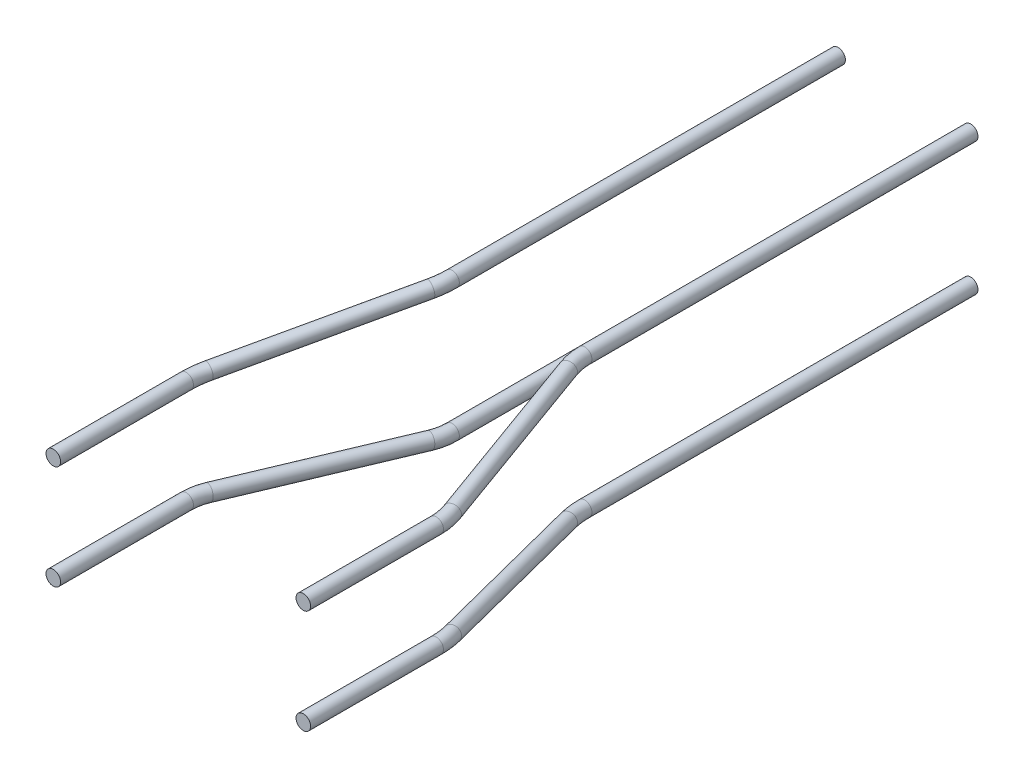
ISO-10303-21;
HEADER;
FILE_DESCRIPTION(('STEP AP214'),'2;1');
FILE_NAME('part.step','',(''),(''),'','','');
FILE_SCHEMA(('AUTOMOTIVE_DESIGN { 1 0 10303 214 1 1 1 1 }'));
ENDSEC;
DATA;
#1=APPLICATION_CONTEXT('core data for automotive mechanical design processes');
#2=APPLICATION_PROTOCOL_DEFINITION('international standard','automotive_design',2000,#1);
#3=PRODUCT_CONTEXT('',#1,'mechanical');
#4=PRODUCT('Part','Part','',(#3));
#5=PRODUCT_RELATED_PRODUCT_CATEGORY('part','',(#4));
#6=PRODUCT_DEFINITION_FORMATION('','',#4);
#7=PRODUCT_DEFINITION_CONTEXT('part definition',#1,'design');
#8=PRODUCT_DEFINITION('design','',#6,#7);
#9=PRODUCT_DEFINITION_SHAPE('','',#8);
#10=(LENGTH_UNIT() NAMED_UNIT(*) SI_UNIT(.MILLI.,.METRE.));
#11=(NAMED_UNIT(*) PLANE_ANGLE_UNIT() SI_UNIT($,.RADIAN.));
#12=(NAMED_UNIT(*) SI_UNIT($,.STERADIAN.) SOLID_ANGLE_UNIT());
#13=UNCERTAINTY_MEASURE_WITH_UNIT(LENGTH_MEASURE(1.E-05),#10,'distance_accuracy_value','');
#14=(GEOMETRIC_REPRESENTATION_CONTEXT(3) GLOBAL_UNCERTAINTY_ASSIGNED_CONTEXT((#13)) GLOBAL_UNIT_ASSIGNED_CONTEXT((#10,
#11,#12)) REPRESENTATION_CONTEXT('',''));
#15=CARTESIAN_POINT('',(0.,0.,0.));
#16=DIRECTION('',(0.,0.,1.));
#17=DIRECTION('',(1.,0.,0.));
#18=AXIS2_PLACEMENT_3D('',#15,#16,#17);
#19=CARTESIAN_POINT('',(271.819805153395,-31.8198051533945,-40.0000000000003));
#20=DIRECTION('',(0.,0.,-1.));
#21=DIRECTION('',(-1.,0.,0.));
#22=AXIS2_PLACEMENT_3D('',#19,#20,#21);
#23=PLANE('',#22);
#24=CARTESIAN_POINT('',(271.819805153395,-31.8198051533945,-40.0000000000003));
#25=DIRECTION('',(0.,0.,-1.));
#26=DIRECTION('',(-1.,0.,0.));
#27=AXIS2_PLACEMENT_3D('',#24,#25,#26);
#28=CIRCLE('',#27,3.5);
#29=CARTESIAN_POINT('',(268.319805153395,-31.8198051533945,-40.0000000000003));
#30=VERTEX_POINT('',#29);
#31=EDGE_CURVE('E120',#30,#30,#28,.T.);
#32=ORIENTED_EDGE('',*,*,#31,.T.);
#33=EDGE_LOOP('',(#32));
#34=FACE_BOUND('',#33,.T.);
#35=ADVANCED_FACE('F96',(#34),#23,.T.);
#36=CARTESIAN_POINT('',(300.,-25.,308.5));
#37=DIRECTION('',(0.,0.,-1.));
#38=DIRECTION('',(-1.,0.,0.));
#39=AXIS2_PLACEMENT_3D('',#36,#37,#38);
#40=PLANE('',#39);
#41=CARTESIAN_POINT('',(300.,-25.,308.5));
#42=DIRECTION('',(0.,0.,-1.));
#43=DIRECTION('',(-1.,0.,0.));
#44=AXIS2_PLACEMENT_3D('',#41,#42,#43);
#45=CIRCLE('',#44,3.5);
#46=CARTESIAN_POINT('',(296.5,-25.,308.5));
#47=VERTEX_POINT('',#46);
#48=EDGE_CURVE('E12',#47,#47,#45,.T.);
#49=ORIENTED_EDGE('',*,*,#48,.F.);
#50=EDGE_LOOP('',(#49));
#51=FACE_BOUND('',#50,.T.);
#52=ADVANCED_FACE('F127',(#51),#40,.F.);
#53=CARTESIAN_POINT('',(271.819805153395,-31.8198051533945,-40.0000000000003));
#54=DIRECTION('',(0.,0.,1.));
#55=DIRECTION('',(1.,0.,0.));
#56=AXIS2_PLACEMENT_3D('',#53,#54,#55);
#57=CYLINDRICAL_SURFACE('',#56,3.5);
#58=CARTESIAN_POINT('',(271.819805153395,-31.8198051533945,145.286984437279));
#59=DIRECTION('',(0.,0.,-1.));
#60=DIRECTION('',(-1.,0.,0.));
#61=AXIS2_PLACEMENT_3D('',#58,#59,#60);
#62=CIRCLE('',#61,3.5);
#63=CARTESIAN_POINT('',(268.41800507666,-32.6430646737923,145.286984437279));
#64=VERTEX_POINT('',#63);
#65=EDGE_CURVE('E113',#64,#64,#62,.T.);
#66=ORIENTED_EDGE('',*,*,#65,.T.);
#67=EDGE_LOOP('',(#66));
#68=FACE_BOUND('',#67,.T.);
#69=ORIENTED_EDGE('',*,*,#31,.F.);
#70=EDGE_LOOP('',(#69));
#71=FACE_BOUND('',#70,.T.);
#72=ADVANCED_FACE('F123',(#68,#71),#57,.T.);
#73=CARTESIAN_POINT('',(300.978091525409,-24.7632949785554,145.286984437279));
#74=DIRECTION('',(-0.23521700582797,0.971942879067142,0.));
#75=DIRECTION('',(-0.971942879067142,-0.23521700582797,0.));
#76=AXIS2_PLACEMENT_3D('',#73,#74,#75);
#77=TOROIDAL_SURFACE('',#76,29.9999999999994,3.5);
#78=CARTESIAN_POINT('',(273.224424766855,-31.4798773377575,154.485979103394));
#79=DIRECTION('',(-0.298029912010218,-0.0721253327330302,-0.95182777219691));
#80=DIRECTION('',(-0.954492998963303,0.0110130139935138,0.298029912010218));
#81=AXIS2_PLACEMENT_3D('',#78,#79,#80);
#82=CIRCLE('',#81,3.5);
#83=CARTESIAN_POINT('',(269.986496978358,-32.2634786129976,155.559195147774));
#84=VERTEX_POINT('',#83);
#85=EDGE_CURVE('E109',#84,#84,#82,.T.);
#86=CARTESIAN_POINT('',(300.978091525409,-24.7632949785554,145.286984437279));
#87=DIRECTION('',(-0.23521700582797,0.971942879067142,0.));
#88=DIRECTION('',(-0.971942879067142,-0.23521700582797,0.));
#89=AXIS2_PLACEMENT_3D('',#86,#87,#88);
#90=CIRCLE('',#89,33.4999999999994);
#91=EDGE_CURVE('',#64,#84,#90,.T.);
#92=ORIENTED_EDGE('',*,*,#65,.F.);
#93=ORIENTED_EDGE('',*,*,#85,.T.);
#94=ORIENTED_EDGE('',*,*,#91,.T.);
#95=ORIENTED_EDGE('',*,*,#91,.F.);
#96=EDGE_LOOP('',(#92,#94,#93,#95));
#97=FACE_BOUND('',#96,.T.);
#98=ADVANCED_FACE('F121',(#97),#77,.T.);
#99=CARTESIAN_POINT('',(273.224424766855,-31.4798773377575,154.485979103394));
#100=DIRECTION('',(0.298029912010215,0.0721253327330292,0.951827772196911));
#101=DIRECTION('',(0.954313207771096,0.,-0.298808134885317));
#102=AXIS2_PLACEMENT_3D('',#99,#100,#101);
#103=CYLINDRICAL_SURFACE('',#102,3.5);
#104=CARTESIAN_POINT('',(298.59538038654,-25.3399278156372,235.514020896606));
#105=DIRECTION('',(-0.298029912010214,-0.072125332733029,-0.951827772196911));
#106=DIRECTION('',(-0.954492998963305,0.0110130139935135,0.298029912010214));
#107=AXIS2_PLACEMENT_3D('',#104,#105,#106);
#108=CIRCLE('',#107,3.5);
#109=CARTESIAN_POINT('',(301.833308175038,-24.5563265403969,234.440804852226));
#110=VERTEX_POINT('',#109);
#111=EDGE_CURVE('E106',#110,#110,#108,.T.);
#112=ORIENTED_EDGE('',*,*,#111,.T.);
#113=EDGE_LOOP('',(#112));
#114=FACE_BOUND('',#113,.T.);
#115=ORIENTED_EDGE('',*,*,#85,.F.);
#116=EDGE_LOOP('',(#115));
#117=FACE_BOUND('',#116,.T.);
#118=ADVANCED_FACE('F135',(#114,#117),#103,.T.);
#119=CARTESIAN_POINT('',(270.841713627986,-32.0565101748391,244.713015562721));
#120=DIRECTION('',(0.23521700582797,-0.971942879067142,0.));
#121=DIRECTION('',(0.971942879067142,0.23521700582797,0.));
#122=AXIS2_PLACEMENT_3D('',#119,#120,#121);
#123=TOROIDAL_SURFACE('',#122,30.0000000000001,3.5);
#124=CARTESIAN_POINT('',(300.,-25.0000000000002,244.71301556272));
#125=DIRECTION('',(0.,0.,-1.));
#126=DIRECTION('',(-1.,0.,0.));
#127=AXIS2_PLACEMENT_3D('',#124,#125,#126);
#128=CIRCLE('',#127,3.5);
#129=CARTESIAN_POINT('',(303.401800076735,-24.1767404796024,244.71301556272));
#130=VERTEX_POINT('',#129);
#131=EDGE_CURVE('E105',#130,#130,#128,.T.);
#132=CARTESIAN_POINT('',(270.841713627986,-32.0565101748391,244.713015562721));
#133=DIRECTION('',(0.23521700582797,-0.971942879067142,0.));
#134=DIRECTION('',(0.971942879067142,0.23521700582797,0.));
#135=AXIS2_PLACEMENT_3D('',#132,#133,#134);
#136=CIRCLE('',#135,33.5000000000001);
#137=EDGE_CURVE('',#110,#130,#136,.T.);
#138=ORIENTED_EDGE('',*,*,#111,.F.);
#139=ORIENTED_EDGE('',*,*,#131,.T.);
#140=ORIENTED_EDGE('',*,*,#137,.T.);
#141=ORIENTED_EDGE('',*,*,#137,.F.);
#142=EDGE_LOOP('',(#138,#140,#139,#141));
#143=FACE_BOUND('',#142,.T.);
#144=ADVANCED_FACE('F139',(#143),#123,.T.);
#145=CARTESIAN_POINT('',(300.,-25.,244.71301556272));
#146=DIRECTION('',(0.,0.,1.));
#147=DIRECTION('',(1.,0.,0.));
#148=AXIS2_PLACEMENT_3D('',#145,#146,#147);
#149=CYLINDRICAL_SURFACE('',#148,3.5);
#150=ORIENTED_EDGE('',*,*,#48,.T.);
#151=EDGE_LOOP('',(#150));
#152=FACE_BOUND('',#151,.T.);
#153=ORIENTED_EDGE('',*,*,#131,.F.);
#154=EDGE_LOOP('',(#153));
#155=FACE_BOUND('',#154,.T.);
#156=ADVANCED_FACE('F140',(#152,#155),#149,.T.);
#157=CLOSED_SHELL('',(#35,#52,#72,#98,#118,#144,#156));
#158=MANIFOLD_SOLID_BREP('B2',#157);
#159=CARTESIAN_POINT('',(208.180194846605,-31.8198051533946,-40.));
#160=DIRECTION('',(0.,0.,-1.));
#161=DIRECTION('',(-1.,0.,0.));
#162=AXIS2_PLACEMENT_3D('',#159,#160,#161);
#163=PLANE('',#162);
#164=CARTESIAN_POINT('',(208.180194846605,-31.8198051533946,-40.));
#165=DIRECTION('',(0.,0.,-1.));
#166=DIRECTION('',(-1.,0.,0.));
#167=AXIS2_PLACEMENT_3D('',#164,#165,#166);
#168=CIRCLE('',#167,3.5);
#169=CARTESIAN_POINT('',(204.680194846605,-31.8198051533946,-40.));
#170=VERTEX_POINT('',#169);
#171=EDGE_CURVE('E226',#170,#170,#168,.T.);
#172=ORIENTED_EDGE('',*,*,#171,.T.);
#173=EDGE_LOOP('',(#172));
#174=FACE_BOUND('',#173,.T.);
#175=ADVANCED_FACE('F202',(#174),#163,.T.);
#176=CARTESIAN_POINT('',(180.,-25.,308.5));
#177=DIRECTION('',(0.,0.,-1.));
#178=DIRECTION('',(-1.,0.,0.));
#179=AXIS2_PLACEMENT_3D('',#176,#177,#178);
#180=PLANE('',#179);
#181=CARTESIAN_POINT('',(180.,-25.,308.5));
#182=DIRECTION('',(0.,0.,-1.));
#183=DIRECTION('',(-1.,0.,0.));
#184=AXIS2_PLACEMENT_3D('',#181,#182,#183);
#185=CIRCLE('',#184,3.5);
#186=CARTESIAN_POINT('',(176.5,-25.,308.5));
#187=VERTEX_POINT('',#186);
#188=EDGE_CURVE('E92',#187,#187,#185,.T.);
#189=ORIENTED_EDGE('',*,*,#188,.F.);
#190=EDGE_LOOP('',(#189));
#191=FACE_BOUND('',#190,.T.);
#192=ADVANCED_FACE('F231',(#191),#180,.F.);
#193=CARTESIAN_POINT('',(208.180194846605,-31.8198051533946,-40.));
#194=DIRECTION('',(0.,0.,1.));
#195=DIRECTION('',(1.,0.,0.));
#196=AXIS2_PLACEMENT_3D('',#193,#194,#195);
#197=CYLINDRICAL_SURFACE('',#196,3.5);
#198=CARTESIAN_POINT('',(208.180194846605,-31.8198051533946,145.286984437279));
#199=DIRECTION('',(0.,0.,-1.));
#200=DIRECTION('',(-1.,0.,0.));
#201=AXIS2_PLACEMENT_3D('',#198,#199,#200);
#202=CIRCLE('',#201,3.5);
#203=CARTESIAN_POINT('',(211.58199492334,-32.6430646737925,145.286984437279));
#204=VERTEX_POINT('',#203);
#205=EDGE_CURVE('E221',#204,#204,#202,.T.);
#206=ORIENTED_EDGE('',*,*,#205,.T.);
#207=EDGE_LOOP('',(#206));
#208=FACE_BOUND('',#207,.T.);
#209=ORIENTED_EDGE('',*,*,#171,.F.);
#210=EDGE_LOOP('',(#209));
#211=FACE_BOUND('',#210,.T.);
#212=ADVANCED_FACE('F235',(#208,#211),#197,.T.);
#213=CARTESIAN_POINT('',(179.021908474591,-24.7632949785555,145.286984437279));
#214=DIRECTION('',(-0.23521700582797,-0.971942879067142,0.));
#215=DIRECTION('',(0.971942879067142,-0.23521700582797,0.));
#216=AXIS2_PLACEMENT_3D('',#213,#214,#215);
#217=TOROIDAL_SURFACE('',#216,30.0000000000001,3.5);
#218=CARTESIAN_POINT('',(206.775575233145,-31.4798773377575,154.485979103394));
#219=DIRECTION('',(0.298029912010214,-0.0721253327330289,-0.951827772196911));
#220=DIRECTION('',(-0.954492998963304,-0.0110130139935129,-0.298029912010213));
#221=AXIS2_PLACEMENT_3D('',#218,#219,#220);
#222=CIRCLE('',#221,3.5);
#223=CARTESIAN_POINT('',(210.013503021643,-32.2634786129977,155.559195147774));
#224=VERTEX_POINT('',#223);
#225=EDGE_CURVE('E218',#224,#224,#222,.T.);
#226=CARTESIAN_POINT('',(179.021908474591,-24.7632949785555,145.286984437279));
#227=DIRECTION('',(-0.23521700582797,-0.971942879067142,0.));
#228=DIRECTION('',(0.971942879067142,-0.23521700582797,0.));
#229=AXIS2_PLACEMENT_3D('',#226,#227,#228);
#230=CIRCLE('',#229,33.5000000000001);
#231=EDGE_CURVE('',#204,#224,#230,.T.);
#232=ORIENTED_EDGE('',*,*,#205,.F.);
#233=ORIENTED_EDGE('',*,*,#225,.T.);
#234=ORIENTED_EDGE('',*,*,#231,.T.);
#235=ORIENTED_EDGE('',*,*,#231,.F.);
#236=EDGE_LOOP('',(#232,#234,#233,#235));
#237=FACE_BOUND('',#236,.T.);
#238=ADVANCED_FACE('F234',(#237),#217,.T.);
#239=CARTESIAN_POINT('',(206.775575233145,-31.4798773377575,154.485979103394));
#240=DIRECTION('',(-0.298029912010214,0.0721253327330291,0.951827772196911));
#241=DIRECTION('',(0.954313207771096,0.,0.298808134885316));
#242=AXIS2_PLACEMENT_3D('',#239,#240,#241);
#243=CYLINDRICAL_SURFACE('',#242,3.5);
#244=CARTESIAN_POINT('',(181.40461961346,-25.3399278156372,235.514020896606));
#245=DIRECTION('',(0.298029912010214,-0.072125332733029,-0.951827772196911));
#246=DIRECTION('',(-0.954492998963304,-0.0110130139935128,-0.298029912010214));
#247=AXIS2_PLACEMENT_3D('',#244,#245,#246);
#248=CIRCLE('',#247,3.5);
#249=CARTESIAN_POINT('',(178.166691824962,-24.5563265403969,234.440804852226));
#250=VERTEX_POINT('',#249);
#251=EDGE_CURVE('E214',#250,#250,#248,.T.);
#252=ORIENTED_EDGE('',*,*,#251,.T.);
#253=EDGE_LOOP('',(#252));
#254=FACE_BOUND('',#253,.T.);
#255=ORIENTED_EDGE('',*,*,#225,.F.);
#256=EDGE_LOOP('',(#255));
#257=FACE_BOUND('',#256,.T.);
#258=ADVANCED_FACE('F241',(#254,#257),#243,.T.);
#259=CARTESIAN_POINT('',(209.158286372014,-32.0565101748391,244.713015562721));
#260=DIRECTION('',(0.23521700582797,0.971942879067142,0.));
#261=DIRECTION('',(-0.971942879067142,0.23521700582797,0.));
#262=AXIS2_PLACEMENT_3D('',#259,#260,#261);
#263=TOROIDAL_SURFACE('',#262,30.,3.5);
#264=CARTESIAN_POINT('',(180.,-24.9999999999997,244.713015562721));
#265=DIRECTION('',(0.,0.,-1.));
#266=DIRECTION('',(-1.,0.,0.));
#267=AXIS2_PLACEMENT_3D('',#264,#265,#266);
#268=CIRCLE('',#267,3.5);
#269=CARTESIAN_POINT('',(176.598199923265,-24.1767404796017,244.713015562721));
#270=VERTEX_POINT('',#269);
#271=EDGE_CURVE('E211',#270,#270,#268,.T.);
#272=CARTESIAN_POINT('',(209.158286372014,-32.0565101748391,244.713015562721));
#273=DIRECTION('',(0.23521700582797,0.971942879067142,0.));
#274=DIRECTION('',(-0.971942879067142,0.23521700582797,0.));
#275=AXIS2_PLACEMENT_3D('',#272,#273,#274);
#276=CIRCLE('',#275,33.5);
#277=EDGE_CURVE('',#250,#270,#276,.T.);
#278=ORIENTED_EDGE('',*,*,#251,.F.);
#279=ORIENTED_EDGE('',*,*,#271,.T.);
#280=ORIENTED_EDGE('',*,*,#277,.T.);
#281=ORIENTED_EDGE('',*,*,#277,.F.);
#282=EDGE_LOOP('',(#278,#280,#279,#281));
#283=FACE_BOUND('',#282,.T.);
#284=ADVANCED_FACE('F248',(#283),#263,.T.);
#285=CARTESIAN_POINT('',(180.,-25.,244.713015562721));
#286=DIRECTION('',(0.,0.,1.));
#287=DIRECTION('',(0.,-1.,0.));
#288=AXIS2_PLACEMENT_3D('',#285,#286,#287);
#289=CYLINDRICAL_SURFACE('',#288,3.5);
#290=ORIENTED_EDGE('',*,*,#188,.T.);
#291=EDGE_LOOP('',(#290));
#292=FACE_BOUND('',#291,.T.);
#293=ORIENTED_EDGE('',*,*,#271,.F.);
#294=EDGE_LOOP('',(#293));
#295=FACE_BOUND('',#294,.T.);
#296=ADVANCED_FACE('F247',(#292,#295),#289,.T.);
#297=CLOSED_SHELL('',(#175,#192,#212,#238,#258,#284,#296));
#298=MANIFOLD_SOLID_BREP('B7',#297);
#299=CARTESIAN_POINT('',(208.180194846605,31.8198051533946,-40.));
#300=DIRECTION('',(0.,0.,-1.));
#301=DIRECTION('',(-1.,0.,0.));
#302=AXIS2_PLACEMENT_3D('',#299,#300,#301);
#303=PLANE('',#302);
#304=CARTESIAN_POINT('',(208.180194846605,31.8198051533946,-40.));
#305=DIRECTION('',(0.,0.,-1.));
#306=DIRECTION('',(-1.,0.,0.));
#307=AXIS2_PLACEMENT_3D('',#304,#305,#306);
#308=CIRCLE('',#307,3.5);
#309=CARTESIAN_POINT('',(204.680194846605,31.8198051533946,-40.));
#310=VERTEX_POINT('',#309);
#311=EDGE_CURVE('E333',#310,#310,#308,.T.);
#312=ORIENTED_EDGE('',*,*,#311,.T.);
#313=EDGE_LOOP('',(#312));
#314=FACE_BOUND('',#313,.T.);
#315=ADVANCED_FACE('F311',(#314),#303,.T.);
#316=CARTESIAN_POINT('',(180.,25.,308.5));
#317=DIRECTION('',(0.,0.,-1.));
#318=DIRECTION('',(-1.,0.,0.));
#319=AXIS2_PLACEMENT_3D('',#316,#317,#318);
#320=PLANE('',#319);
#321=CARTESIAN_POINT('',(180.,25.,308.5));
#322=DIRECTION('',(0.,0.,-1.));
#323=DIRECTION('',(-1.,0.,0.));
#324=AXIS2_PLACEMENT_3D('',#321,#322,#323);
#325=CIRCLE('',#324,3.5);
#326=CARTESIAN_POINT('',(176.5,25.,308.5));
#327=VERTEX_POINT('',#326);
#328=EDGE_CURVE('E204',#327,#327,#325,.T.);
#329=ORIENTED_EDGE('',*,*,#328,.F.);
#330=EDGE_LOOP('',(#329));
#331=FACE_BOUND('',#330,.T.);
#332=ADVANCED_FACE('F343',(#331),#320,.F.);
#333=CARTESIAN_POINT('',(208.180194846605,31.8198051533946,-40.));
#334=DIRECTION('',(0.,0.,1.));
#335=DIRECTION('',(1.,0.,0.));
#336=AXIS2_PLACEMENT_3D('',#333,#334,#335);
#337=CYLINDRICAL_SURFACE('',#336,3.5);
#338=CARTESIAN_POINT('',(208.180194846605,31.8198051533946,145.286984437279));
#339=DIRECTION('',(0.,0.,-1.));
#340=DIRECTION('',(-1.,0.,0.));
#341=AXIS2_PLACEMENT_3D('',#338,#339,#340);
#342=CIRCLE('',#341,3.5);
#343=CARTESIAN_POINT('',(211.58199492334,32.6430646737925,145.286984437279));
#344=VERTEX_POINT('',#343);
#345=EDGE_CURVE('E335',#344,#344,#342,.T.);
#346=ORIENTED_EDGE('',*,*,#345,.T.);
#347=EDGE_LOOP('',(#346));
#348=FACE_BOUND('',#347,.T.);
#349=ORIENTED_EDGE('',*,*,#311,.F.);
#350=EDGE_LOOP('',(#349));
#351=FACE_BOUND('',#350,.T.);
#352=ADVANCED_FACE('F337',(#348,#351),#337,.T.);
#353=CARTESIAN_POINT('',(179.021908474591,24.7632949785555,145.286984437279));
#354=DIRECTION('',(0.235217005827971,-0.971942879067142,0.));
#355=DIRECTION('',(0.971942879067142,0.235217005827971,0.));
#356=AXIS2_PLACEMENT_3D('',#353,#354,#355);
#357=TOROIDAL_SURFACE('',#356,30.,3.5);
#358=CARTESIAN_POINT('',(206.775575233145,31.4798773377575,154.485979103394));
#359=DIRECTION('',(0.298029912010213,0.0721253327330291,-0.951827772196911));
#360=DIRECTION('',(-0.954492998963305,0.0110130139935131,-0.298029912010213));
#361=AXIS2_PLACEMENT_3D('',#358,#359,#360);
#362=CIRCLE('',#361,3.5);
#363=CARTESIAN_POINT('',(210.013503021643,32.2634786129977,155.559195147774));
#364=VERTEX_POINT('',#363);
#365=EDGE_CURVE('E330',#364,#364,#362,.T.);
#366=CARTESIAN_POINT('',(179.021908474591,24.7632949785555,145.286984437279));
#367=DIRECTION('',(0.235217005827971,-0.971942879067142,0.));
#368=DIRECTION('',(0.971942879067142,0.235217005827971,0.));
#369=AXIS2_PLACEMENT_3D('',#366,#367,#368);
#370=CIRCLE('',#369,33.5);
#371=EDGE_CURVE('',#344,#364,#370,.T.);
#372=ORIENTED_EDGE('',*,*,#345,.F.);
#373=ORIENTED_EDGE('',*,*,#365,.T.);
#374=ORIENTED_EDGE('',*,*,#371,.T.);
#375=ORIENTED_EDGE('',*,*,#371,.F.);
#376=EDGE_LOOP('',(#372,#374,#373,#375));
#377=FACE_BOUND('',#376,.T.);
#378=ADVANCED_FACE('F345',(#377),#357,.T.);
#379=CARTESIAN_POINT('',(206.775575233145,31.4798773377575,154.485979103394));
#380=DIRECTION('',(-0.298029912010214,-0.0721253327330292,0.951827772196911));
#381=DIRECTION('',(0.954313207771096,0.,0.298808134885316));
#382=AXIS2_PLACEMENT_3D('',#379,#380,#381);
#383=CYLINDRICAL_SURFACE('',#382,3.5);
#384=CARTESIAN_POINT('',(181.40461961346,25.3399278156372,235.514020896606));
#385=DIRECTION('',(0.298029912010214,0.0721253327330292,-0.951827772196911));
#386=DIRECTION('',(-0.954492998963305,0.011013013993513,-0.298029912010214));
#387=AXIS2_PLACEMENT_3D('',#384,#385,#386);
#388=CIRCLE('',#387,3.5);
#389=CARTESIAN_POINT('',(178.166691824962,24.5563265403969,234.440804852226));
#390=VERTEX_POINT('',#389);
#391=EDGE_CURVE('E323',#390,#390,#388,.T.);
#392=ORIENTED_EDGE('',*,*,#391,.T.);
#393=EDGE_LOOP('',(#392));
#394=FACE_BOUND('',#393,.T.);
#395=ORIENTED_EDGE('',*,*,#365,.F.);
#396=EDGE_LOOP('',(#395));
#397=FACE_BOUND('',#396,.T.);
#398=ADVANCED_FACE('F348',(#394,#397),#383,.T.);
#399=CARTESIAN_POINT('',(209.158286372014,32.0565101748391,244.713015562721));
#400=DIRECTION('',(-0.23521700582797,0.971942879067142,0.));
#401=DIRECTION('',(-0.971942879067142,-0.23521700582797,0.));
#402=AXIS2_PLACEMENT_3D('',#399,#400,#401);
#403=TOROIDAL_SURFACE('',#402,30.,3.5);
#404=CARTESIAN_POINT('',(180.,25.,244.713015562721));
#405=DIRECTION('',(0.,0.,-1.));
#406=DIRECTION('',(-1.,0.,0.));
#407=AXIS2_PLACEMENT_3D('',#404,#405,#406);
#408=CIRCLE('',#407,3.5);
#409=CARTESIAN_POINT('',(176.598199923265,24.1767404796021,244.713015562721));
#410=VERTEX_POINT('',#409);
#411=EDGE_CURVE('E317',#410,#410,#408,.T.);
#412=CARTESIAN_POINT('',(209.158286372014,32.0565101748391,244.713015562721));
#413=DIRECTION('',(-0.23521700582797,0.971942879067142,0.));
#414=DIRECTION('',(-0.971942879067142,-0.23521700582797,0.));
#415=AXIS2_PLACEMENT_3D('',#412,#413,#414);
#416=CIRCLE('',#415,33.5);
#417=EDGE_CURVE('',#390,#410,#416,.T.);
#418=ORIENTED_EDGE('',*,*,#391,.F.);
#419=ORIENTED_EDGE('',*,*,#411,.T.);
#420=ORIENTED_EDGE('',*,*,#417,.T.);
#421=ORIENTED_EDGE('',*,*,#417,.F.);
#422=EDGE_LOOP('',(#418,#420,#419,#421));
#423=FACE_BOUND('',#422,.T.);
#424=ADVANCED_FACE('F357',(#423),#403,.T.);
#425=CARTESIAN_POINT('',(180.,25.,244.713015562721));
#426=DIRECTION('',(0.,0.,1.));
#427=DIRECTION('',(1.,0.,0.));
#428=AXIS2_PLACEMENT_3D('',#425,#426,#427);
#429=CYLINDRICAL_SURFACE('',#428,3.5);
#430=ORIENTED_EDGE('',*,*,#328,.T.);
#431=EDGE_LOOP('',(#430));
#432=FACE_BOUND('',#431,.T.);
#433=ORIENTED_EDGE('',*,*,#411,.F.);
#434=EDGE_LOOP('',(#433));
#435=FACE_BOUND('',#434,.T.);
#436=ADVANCED_FACE('F353',(#432,#435),#429,.T.);
#437=CLOSED_SHELL('',(#315,#332,#352,#378,#398,#424,#436));
#438=MANIFOLD_SOLID_BREP('B89',#437);
#439=CARTESIAN_POINT('',(271.819805153395,31.8198051533951,-40.));
#440=DIRECTION('',(0.,0.,-1.));
#441=DIRECTION('',(0.,1.,0.));
#442=AXIS2_PLACEMENT_3D('',#439,#440,#441);
#443=PLANE('',#442);
#444=CARTESIAN_POINT('',(271.819805153395,31.8198051533951,-40.));
#445=DIRECTION('',(0.,0.,-1.));
#446=DIRECTION('',(0.,1.,0.));
#447=AXIS2_PLACEMENT_3D('',#444,#445,#446);
#448=CIRCLE('',#447,3.5);
#449=CARTESIAN_POINT('',(271.819805153395,35.3198051533951,-40.));
#450=VERTEX_POINT('',#449);
#451=EDGE_CURVE('E436',#450,#450,#448,.T.);
#452=ORIENTED_EDGE('',*,*,#451,.T.);
#453=EDGE_LOOP('',(#452));
#454=FACE_BOUND('',#453,.T.);
#455=ADVANCED_FACE('F414',(#454),#443,.T.);
#456=CARTESIAN_POINT('',(300.,25.,308.5));
#457=DIRECTION('',(0.,0.,-1.));
#458=DIRECTION('',(0.,1.,0.));
#459=AXIS2_PLACEMENT_3D('',#456,#457,#458);
#460=PLANE('',#459);
#461=CARTESIAN_POINT('',(300.,25.,308.5));
#462=DIRECTION('',(0.,0.,-1.));
#463=DIRECTION('',(0.,1.,0.));
#464=AXIS2_PLACEMENT_3D('',#461,#462,#463);
#465=CIRCLE('',#464,3.5);
#466=CARTESIAN_POINT('',(300.,28.5,308.5));
#467=VERTEX_POINT('',#466);
#468=EDGE_CURVE('E315',#467,#467,#465,.T.);
#469=ORIENTED_EDGE('',*,*,#468,.F.);
#470=EDGE_LOOP('',(#469));
#471=FACE_BOUND('',#470,.T.);
#472=ADVANCED_FACE('F441',(#471),#460,.F.);
#473=CARTESIAN_POINT('',(271.819805153395,31.8198051533951,-40.));
#474=DIRECTION('',(0.,0.,1.));
#475=DIRECTION('',(1.,0.,0.));
#476=AXIS2_PLACEMENT_3D('',#473,#474,#475);
#477=CYLINDRICAL_SURFACE('',#476,3.5);
#478=CARTESIAN_POINT('',(271.819805153395,31.8198051533951,145.286984437279));
#479=DIRECTION('',(0.,0.,-1.));
#480=DIRECTION('',(0.,1.,0.));
#481=AXIS2_PLACEMENT_3D('',#478,#479,#480);
#482=CIRCLE('',#481,3.5);
#483=CARTESIAN_POINT('',(268.41800507666,32.6430646737928,145.286984437279));
#484=VERTEX_POINT('',#483);
#485=EDGE_CURVE('E433',#484,#484,#482,.T.);
#486=ORIENTED_EDGE('',*,*,#485,.T.);
#487=EDGE_LOOP('',(#486));
#488=FACE_BOUND('',#487,.T.);
#489=ORIENTED_EDGE('',*,*,#451,.F.);
#490=EDGE_LOOP('',(#489));
#491=FACE_BOUND('',#490,.T.);
#492=ADVANCED_FACE('F442',(#488,#491),#477,.T.);
#493=CARTESIAN_POINT('',(300.978091525409,24.7632949785565,145.286984437279));
#494=DIRECTION('',(0.23521700582797,0.971942879067142,0.));
#495=DIRECTION('',(-0.971942879067142,0.23521700582797,0.));
#496=AXIS2_PLACEMENT_3D('',#493,#494,#495);
#497=TOROIDAL_SURFACE('',#496,29.9999999999995,3.5);
#498=CARTESIAN_POINT('',(273.224424766855,31.4798773377574,154.485979103394));
#499=DIRECTION('',(-0.298029912010218,0.0721253327330315,-0.951827772196909));
#500=DIRECTION('',(0.011013013993514,0.997334773233606,0.0721253327330313));
#501=AXIS2_PLACEMENT_3D('',#498,#499,#500);
#502=CIRCLE('',#501,3.5);
#503=CARTESIAN_POINT('',(269.986496978358,32.2634786129974,155.559195147774));
#504=VERTEX_POINT('',#503);
#505=EDGE_CURVE('E428',#504,#504,#502,.T.);
#506=CARTESIAN_POINT('',(300.978091525409,24.7632949785565,145.286984437279));
#507=DIRECTION('',(0.23521700582797,0.971942879067142,0.));
#508=DIRECTION('',(-0.971942879067142,0.23521700582797,0.));
#509=AXIS2_PLACEMENT_3D('',#506,#507,#508);
#510=CIRCLE('',#509,33.4999999999995);
#511=EDGE_CURVE('',#484,#504,#510,.T.);
#512=ORIENTED_EDGE('',*,*,#485,.F.);
#513=ORIENTED_EDGE('',*,*,#505,.T.);
#514=ORIENTED_EDGE('',*,*,#511,.T.);
#515=ORIENTED_EDGE('',*,*,#511,.F.);
#516=EDGE_LOOP('',(#512,#514,#513,#515));
#517=FACE_BOUND('',#516,.T.);
#518=ADVANCED_FACE('F444',(#517),#497,.T.);
#519=CARTESIAN_POINT('',(273.224424766855,31.4798773377574,154.485979103394));
#520=DIRECTION('',(0.298029912010214,-0.0721253327330292,0.951827772196911));
#521=DIRECTION('',(0.954313207771096,0.,-0.298808134885317));
#522=AXIS2_PLACEMENT_3D('',#519,#520,#521);
#523=CYLINDRICAL_SURFACE('',#522,3.5);
#524=CARTESIAN_POINT('',(298.59538038654,25.3399278156372,235.514020896606));
#525=DIRECTION('',(-0.298029912010214,0.0721253327330289,-0.951827772196911));
#526=DIRECTION('',(0.0110130139935133,0.997334773233606,0.0721253327330288));
#527=AXIS2_PLACEMENT_3D('',#524,#525,#526);
#528=CIRCLE('',#527,3.5);
#529=CARTESIAN_POINT('',(301.833308175038,24.5563265403969,234.440804852226));
#530=VERTEX_POINT('',#529);
#531=EDGE_CURVE('E424',#530,#530,#528,.T.);
#532=ORIENTED_EDGE('',*,*,#531,.T.);
#533=EDGE_LOOP('',(#532));
#534=FACE_BOUND('',#533,.T.);
#535=ORIENTED_EDGE('',*,*,#505,.F.);
#536=EDGE_LOOP('',(#535));
#537=FACE_BOUND('',#536,.T.);
#538=ADVANCED_FACE('F452',(#534,#537),#523,.T.);
#539=CARTESIAN_POINT('',(270.841713627986,32.0565101748391,244.713015562721));
#540=DIRECTION('',(-0.235217005827972,-0.971942879067141,0.));
#541=DIRECTION('',(0.971942879067141,-0.235217005827972,0.));
#542=AXIS2_PLACEMENT_3D('',#539,#540,#541);
#543=TOROIDAL_SURFACE('',#542,30.,3.5);
#544=CARTESIAN_POINT('',(300.,24.9999999999999,244.713015562721));
#545=DIRECTION('',(0.,0.,-1.));
#546=DIRECTION('',(0.,1.,0.));
#547=AXIS2_PLACEMENT_3D('',#544,#545,#546);
#548=CIRCLE('',#547,3.5);
#549=CARTESIAN_POINT('',(303.401800076735,24.176740479602,244.713015562721));
#550=VERTEX_POINT('',#549);
#551=EDGE_CURVE('E419',#550,#550,#548,.T.);
#552=CARTESIAN_POINT('',(270.841713627986,32.0565101748391,244.713015562721));
#553=DIRECTION('',(-0.235217005827972,-0.971942879067141,0.));
#554=DIRECTION('',(0.971942879067141,-0.235217005827972,0.));
#555=AXIS2_PLACEMENT_3D('',#552,#553,#554);
#556=CIRCLE('',#555,33.5);
#557=EDGE_CURVE('',#530,#550,#556,.T.);
#558=ORIENTED_EDGE('',*,*,#531,.F.);
#559=ORIENTED_EDGE('',*,*,#551,.T.);
#560=ORIENTED_EDGE('',*,*,#557,.T.);
#561=ORIENTED_EDGE('',*,*,#557,.F.);
#562=EDGE_LOOP('',(#558,#560,#559,#561));
#563=FACE_BOUND('',#562,.T.);
#564=ADVANCED_FACE('F460',(#563),#543,.T.);
#565=CARTESIAN_POINT('',(300.,25.,244.713015562721));
#566=DIRECTION('',(0.,0.,1.));
#567=DIRECTION('',(0.,-1.,0.));
#568=AXIS2_PLACEMENT_3D('',#565,#566,#567);
#569=CYLINDRICAL_SURFACE('',#568,3.5);
#570=ORIENTED_EDGE('',*,*,#468,.T.);
#571=EDGE_LOOP('',(#570));
#572=FACE_BOUND('',#571,.T.);
#573=ORIENTED_EDGE('',*,*,#551,.F.);
#574=EDGE_LOOP('',(#573));
#575=FACE_BOUND('',#574,.T.);
#576=ADVANCED_FACE('F451',(#572,#575),#569,.T.);
#577=CLOSED_SHELL('',(#455,#472,#492,#518,#538,#564,#576));
#578=MANIFOLD_SOLID_BREP('B200',#577);
#579=ADVANCED_BREP_SHAPE_REPRESENTATION('',(#18,#158,#298,#438,#578),#14);
#580=SHAPE_DEFINITION_REPRESENTATION(#9,#579);
ENDSEC;
END-ISO-10303-21;
